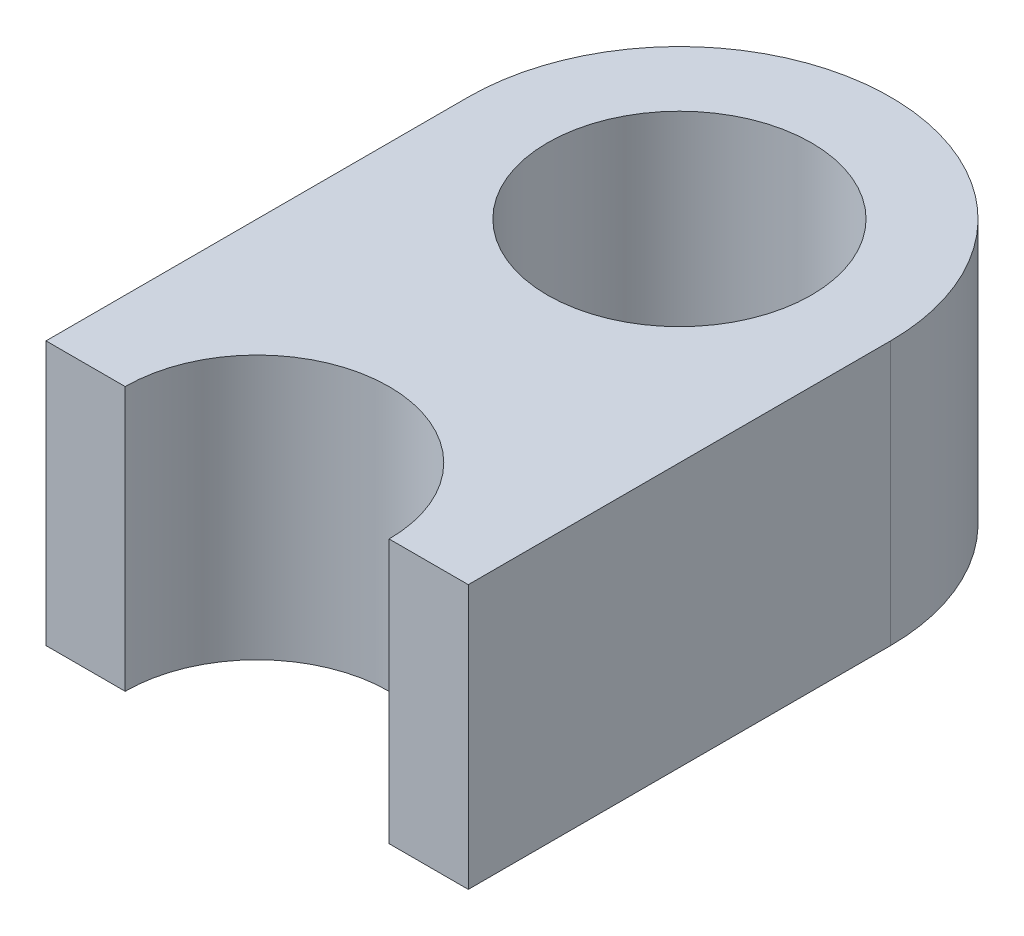
ISO-10303-21;
HEADER;
FILE_DESCRIPTION(('STEP AP214'),'2;1');
FILE_NAME('part.step','',(''),(''),'','','');
FILE_SCHEMA(('AUTOMOTIVE_DESIGN { 1 0 10303 214 1 1 1 1 }'));
ENDSEC;
DATA;
#1=APPLICATION_CONTEXT('core data for automotive mechanical design processes');
#2=APPLICATION_PROTOCOL_DEFINITION('international standard','automotive_design',2000,#1);
#3=PRODUCT_CONTEXT('',#1,'mechanical');
#4=PRODUCT('Part','Part','',(#3));
#5=PRODUCT_RELATED_PRODUCT_CATEGORY('part','',(#4));
#6=PRODUCT_DEFINITION_FORMATION('','',#4);
#7=PRODUCT_DEFINITION_CONTEXT('part definition',#1,'design');
#8=PRODUCT_DEFINITION('design','',#6,#7);
#9=PRODUCT_DEFINITION_SHAPE('','',#8);
#10=(LENGTH_UNIT() NAMED_UNIT(*) SI_UNIT(.MILLI.,.METRE.));
#11=(NAMED_UNIT(*) PLANE_ANGLE_UNIT() SI_UNIT($,.RADIAN.));
#12=(NAMED_UNIT(*) SI_UNIT($,.STERADIAN.) SOLID_ANGLE_UNIT());
#13=UNCERTAINTY_MEASURE_WITH_UNIT(LENGTH_MEASURE(1.E-05),#10,'distance_accuracy_value','');
#14=(GEOMETRIC_REPRESENTATION_CONTEXT(3) GLOBAL_UNCERTAINTY_ASSIGNED_CONTEXT((#13)) GLOBAL_UNIT_ASSIGNED_CONTEXT((#10,
#11,#12)) REPRESENTATION_CONTEXT('',''));
#15=CARTESIAN_POINT('',(0.,0.,0.));
#16=DIRECTION('',(0.,0.,1.));
#17=DIRECTION('',(1.,0.,0.));
#18=AXIS2_PLACEMENT_3D('',#15,#16,#17);
#19=CARTESIAN_POINT('',(13.04,0.5,-1.6));
#20=DIRECTION('',(0.,-1.,0.));
#21=DIRECTION('',(0.,0.,-1.));
#22=AXIS2_PLACEMENT_3D('',#19,#20,#21);
#23=CYLINDRICAL_SURFACE('',#22,0.8);
#24=CARTESIAN_POINT('',(13.04,-0.500000044703484,-1.6));
#25=DIRECTION('',(0.,-1.,0.));
#26=DIRECTION('',(0.,0.,-1.));
#27=AXIS2_PLACEMENT_3D('',#24,#25,#26);
#28=CIRCLE('',#27,0.8);
#29=CARTESIAN_POINT('',(13.84,-0.500000044703484,-1.6));
#30=VERTEX_POINT('',#29);
#31=CARTESIAN_POINT('',(12.24,-0.500000044703484,-1.6));
#32=VERTEX_POINT('',#31);
#33=EDGE_CURVE('E80',#30,#32,#28,.F.);
#34=ORIENTED_EDGE('',*,*,#33,.T.);
#35=DIRECTION('',(0.,1.,0.));
#36=VECTOR('',#35,1.);
#37=CARTESIAN_POINT('',(12.24,0.5,-1.6));
#38=LINE('',#37,#36);
#39=CARTESIAN_POINT('',(12.24,0.5,-1.6));
#40=VERTEX_POINT('',#39);
#41=EDGE_CURVE('E79',#40,#32,#38,.F.);
#42=ORIENTED_EDGE('',*,*,#41,.F.);
#43=CARTESIAN_POINT('',(13.04,0.5,-1.6));
#44=DIRECTION('',(0.,-1.,0.));
#45=DIRECTION('',(0.,0.,-1.));
#46=AXIS2_PLACEMENT_3D('',#43,#44,#45);
#47=CIRCLE('',#46,0.8);
#48=CARTESIAN_POINT('',(13.84,0.5,-1.6));
#49=VERTEX_POINT('',#48);
#50=EDGE_CURVE('E20',#49,#40,#47,.F.);
#51=ORIENTED_EDGE('',*,*,#50,.F.);
#52=DIRECTION('',(0.,1.,0.));
#53=VECTOR('',#52,1.);
#54=CARTESIAN_POINT('',(13.84,0.5,-1.6));
#55=LINE('',#54,#53);
#56=EDGE_CURVE('E65',#30,#49,#55,.T.);
#57=ORIENTED_EDGE('',*,*,#56,.F.);
#58=EDGE_LOOP('',(#34,#42,#51,#57));
#59=FACE_BOUND('',#58,.T.);
#60=ADVANCED_FACE('F17',(#59),#23,.T.);
#61=CARTESIAN_POINT('',(12.24,0.5,0.));
#62=DIRECTION('',(-1.,0.,0.));
#63=DIRECTION('',(0.,0.,1.));
#64=AXIS2_PLACEMENT_3D('',#61,#62,#63);
#65=PLANE('',#64);
#66=DIRECTION('',(0.,0.,1.));
#67=VECTOR('',#66,1.);
#68=CARTESIAN_POINT('',(12.24,-0.500000044703484,-0.5));
#69=LINE('',#68,#67);
#70=CARTESIAN_POINT('',(12.24,-0.500000044703484,0.));
#71=VERTEX_POINT('',#70);
#72=EDGE_CURVE('E120',#32,#71,#69,.T.);
#73=ORIENTED_EDGE('',*,*,#72,.T.);
#74=DIRECTION('',(0.,1.,0.));
#75=VECTOR('',#74,1.);
#76=CARTESIAN_POINT('',(12.24,0.5,0.));
#77=LINE('',#76,#75);
#78=CARTESIAN_POINT('',(12.24,0.5,0.));
#79=VERTEX_POINT('',#78);
#80=EDGE_CURVE('E84',#79,#71,#77,.F.);
#81=ORIENTED_EDGE('',*,*,#80,.F.);
#82=DIRECTION('',(0.,0.,1.));
#83=VECTOR('',#82,1.);
#84=CARTESIAN_POINT('',(12.24,0.5,-0.5));
#85=LINE('',#84,#83);
#86=EDGE_CURVE('E73',#40,#79,#85,.T.);
#87=ORIENTED_EDGE('',*,*,#86,.F.);
#88=ORIENTED_EDGE('',*,*,#41,.T.);
#89=EDGE_LOOP('',(#73,#81,#87,#88));
#90=FACE_BOUND('',#89,.T.);
#91=ADVANCED_FACE('F86',(#90),#65,.T.);
#92=CARTESIAN_POINT('',(12.54,0.5,0.));
#93=DIRECTION('',(0.,0.,1.));
#94=DIRECTION('',(1.,0.,0.));
#95=AXIS2_PLACEMENT_3D('',#92,#93,#94);
#96=PLANE('',#95);
#97=DIRECTION('',(1.,0.,0.));
#98=VECTOR('',#97,1.);
#99=CARTESIAN_POINT('',(20.5,-0.500000044703484,0.));
#100=LINE('',#99,#98);
#101=CARTESIAN_POINT('',(12.54,-0.500000044703484,0.));
#102=VERTEX_POINT('',#101);
#103=EDGE_CURVE('E119',#71,#102,#100,.T.);
#104=ORIENTED_EDGE('',*,*,#103,.T.);
#105=DIRECTION('',(0.,-1.,0.));
#106=VECTOR('',#105,1.);
#107=CARTESIAN_POINT('',(12.54,0.5,0.));
#108=LINE('',#107,#106);
#109=CARTESIAN_POINT('',(12.54,0.5,0.));
#110=VERTEX_POINT('',#109);
#111=EDGE_CURVE('E106',#102,#110,#108,.F.);
#112=ORIENTED_EDGE('',*,*,#111,.T.);
#113=DIRECTION('',(1.,0.,0.));
#114=VECTOR('',#113,1.);
#115=CARTESIAN_POINT('',(20.5,0.5,0.));
#116=LINE('',#115,#114);
#117=EDGE_CURVE('E88',#79,#110,#116,.T.);
#118=ORIENTED_EDGE('',*,*,#117,.F.);
#119=ORIENTED_EDGE('',*,*,#80,.T.);
#120=EDGE_LOOP('',(#104,#112,#118,#119));
#121=FACE_BOUND('',#120,.T.);
#122=ADVANCED_FACE('F153',(#121),#96,.T.);
#123=CARTESIAN_POINT('',(13.04,0.5,0.));
#124=DIRECTION('',(0.,-1.,0.));
#125=DIRECTION('',(0.,0.,-1.));
#126=AXIS2_PLACEMENT_3D('',#123,#124,#125);
#127=CYLINDRICAL_SURFACE('',#126,0.5);
#128=ORIENTED_EDGE('',*,*,#111,.F.);
#129=CARTESIAN_POINT('',(13.04,-0.500000044703484,0.));
#130=DIRECTION('',(0.,-1.,0.));
#131=DIRECTION('',(0.,0.,-1.));
#132=AXIS2_PLACEMENT_3D('',#129,#130,#131);
#133=CIRCLE('',#132,0.5);
#134=CARTESIAN_POINT('',(13.54,-0.500000044703484,0.));
#135=VERTEX_POINT('',#134);
#136=EDGE_CURVE('E115',#102,#135,#133,.T.);
#137=ORIENTED_EDGE('',*,*,#136,.T.);
#138=DIRECTION('',(0.,1.,0.));
#139=VECTOR('',#138,1.);
#140=CARTESIAN_POINT('',(13.54,0.5,0.));
#141=LINE('',#140,#139);
#142=CARTESIAN_POINT('',(13.54,0.5,0.));
#143=VERTEX_POINT('',#142);
#144=EDGE_CURVE('E102',#143,#135,#141,.F.);
#145=ORIENTED_EDGE('',*,*,#144,.F.);
#146=CARTESIAN_POINT('',(13.04,0.5,0.));
#147=DIRECTION('',(0.,-1.,0.));
#148=DIRECTION('',(0.,0.,-1.));
#149=AXIS2_PLACEMENT_3D('',#146,#147,#148);
#150=CIRCLE('',#149,0.5);
#151=EDGE_CURVE('E90',#110,#143,#150,.T.);
#152=ORIENTED_EDGE('',*,*,#151,.F.);
#153=EDGE_LOOP('',(#128,#137,#145,#152));
#154=FACE_BOUND('',#153,.T.);
#155=ADVANCED_FACE('F150',(#154),#127,.F.);
#156=CARTESIAN_POINT('',(13.84,0.5,0.));
#157=DIRECTION('',(0.,0.,1.));
#158=DIRECTION('',(1.,0.,0.));
#159=AXIS2_PLACEMENT_3D('',#156,#157,#158);
#160=PLANE('',#159);
#161=DIRECTION('',(1.,0.,0.));
#162=VECTOR('',#161,1.);
#163=CARTESIAN_POINT('',(20.5,-0.500000044703484,0.));
#164=LINE('',#163,#162);
#165=CARTESIAN_POINT('',(13.84,-0.500000044703484,0.));
#166=VERTEX_POINT('',#165);
#167=EDGE_CURVE('E118',#135,#166,#164,.T.);
#168=ORIENTED_EDGE('',*,*,#167,.T.);
#169=DIRECTION('',(0.,1.,0.));
#170=VECTOR('',#169,1.);
#171=CARTESIAN_POINT('',(13.84,0.5,0.));
#172=LINE('',#171,#170);
#173=CARTESIAN_POINT('',(13.84,0.5,0.));
#174=VERTEX_POINT('',#173);
#175=EDGE_CURVE('E35',#174,#166,#172,.F.);
#176=ORIENTED_EDGE('',*,*,#175,.F.);
#177=DIRECTION('',(1.,0.,0.));
#178=VECTOR('',#177,1.);
#179=CARTESIAN_POINT('',(20.5,0.5,0.));
#180=LINE('',#179,#178);
#181=EDGE_CURVE('E121',#143,#174,#180,.T.);
#182=ORIENTED_EDGE('',*,*,#181,.F.);
#183=ORIENTED_EDGE('',*,*,#144,.T.);
#184=EDGE_LOOP('',(#168,#176,#182,#183));
#185=FACE_BOUND('',#184,.T.);
#186=ADVANCED_FACE('F148',(#185),#160,.T.);
#187=CARTESIAN_POINT('',(13.84,0.5,-1.6));
#188=DIRECTION('',(1.,0.,0.));
#189=DIRECTION('',(0.,0.,-1.));
#190=AXIS2_PLACEMENT_3D('',#187,#188,#189);
#191=PLANE('',#190);
#192=DIRECTION('',(0.,0.,1.));
#193=VECTOR('',#192,1.);
#194=CARTESIAN_POINT('',(13.84,-0.500000044703484,-0.5));
#195=LINE('',#194,#193);
#196=EDGE_CURVE('E114',#166,#30,#195,.F.);
#197=ORIENTED_EDGE('',*,*,#196,.T.);
#198=ORIENTED_EDGE('',*,*,#56,.T.);
#199=DIRECTION('',(0.,0.,1.));
#200=VECTOR('',#199,1.);
#201=CARTESIAN_POINT('',(13.84,0.5,-0.5));
#202=LINE('',#201,#200);
#203=EDGE_CURVE('E76',#174,#49,#202,.F.);
#204=ORIENTED_EDGE('',*,*,#203,.F.);
#205=ORIENTED_EDGE('',*,*,#175,.T.);
#206=EDGE_LOOP('',(#197,#198,#204,#205));
#207=FACE_BOUND('',#206,.T.);
#208=ADVANCED_FACE('F142',(#207),#191,.T.);
#209=CARTESIAN_POINT('',(20.5,0.5,-0.5));
#210=DIRECTION('',(0.,1.,0.));
#211=DIRECTION('',(0.,0.,1.));
#212=AXIS2_PLACEMENT_3D('',#209,#210,#211);
#213=PLANE('',#212);
#214=CARTESIAN_POINT('',(13.04,0.5,-1.6));
#215=DIRECTION('',(0.,-1.,0.));
#216=DIRECTION('',(0.,0.,-1.));
#217=AXIS2_PLACEMENT_3D('',#214,#215,#216);
#218=CIRCLE('',#217,0.5);
#219=CARTESIAN_POINT('',(13.04,0.5,-2.1));
#220=VERTEX_POINT('',#219);
#221=EDGE_CURVE('E26',#220,#220,#218,.T.);
#222=ORIENTED_EDGE('',*,*,#221,.T.);
#223=EDGE_LOOP('',(#222));
#224=FACE_BOUND('',#223,.T.);
#225=ORIENTED_EDGE('',*,*,#151,.T.);
#226=ORIENTED_EDGE('',*,*,#181,.T.);
#227=ORIENTED_EDGE('',*,*,#203,.T.);
#228=ORIENTED_EDGE('',*,*,#50,.T.);
#229=ORIENTED_EDGE('',*,*,#86,.T.);
#230=ORIENTED_EDGE('',*,*,#117,.T.);
#231=EDGE_LOOP('',(#225,#226,#227,#228,#229,#230));
#232=FACE_BOUND('',#231,.T.);
#233=ADVANCED_FACE('F71',(#224,#232),#213,.T.);
#234=CARTESIAN_POINT('',(20.5,-0.500000044703484,-0.5));
#235=DIRECTION('',(0.,1.,0.));
#236=DIRECTION('',(0.,0.,1.));
#237=AXIS2_PLACEMENT_3D('',#234,#235,#236);
#238=PLANE('',#237);
#239=CARTESIAN_POINT('',(13.04,-0.500000044703484,-1.6));
#240=DIRECTION('',(0.,-1.,0.));
#241=DIRECTION('',(0.,0.,-1.));
#242=AXIS2_PLACEMENT_3D('',#239,#240,#241);
#243=CIRCLE('',#242,0.5);
#244=CARTESIAN_POINT('',(13.04,-0.500000044703484,-2.1));
#245=VERTEX_POINT('',#244);
#246=EDGE_CURVE('E11',#245,#245,#243,.F.);
#247=ORIENTED_EDGE('',*,*,#246,.T.);
#248=EDGE_LOOP('',(#247));
#249=FACE_BOUND('',#248,.T.);
#250=ORIENTED_EDGE('',*,*,#167,.F.);
#251=ORIENTED_EDGE('',*,*,#136,.F.);
#252=ORIENTED_EDGE('',*,*,#103,.F.);
#253=ORIENTED_EDGE('',*,*,#72,.F.);
#254=ORIENTED_EDGE('',*,*,#33,.F.);
#255=ORIENTED_EDGE('',*,*,#196,.F.);
#256=EDGE_LOOP('',(#250,#251,#252,#253,#254,#255));
#257=FACE_BOUND('',#256,.T.);
#258=ADVANCED_FACE('F145',(#249,#257),#238,.F.);
#259=CARTESIAN_POINT('',(13.04,0.5,-1.6));
#260=DIRECTION('',(0.,-1.,0.));
#261=DIRECTION('',(0.,0.,-1.));
#262=AXIS2_PLACEMENT_3D('',#259,#260,#261);
#263=CYLINDRICAL_SURFACE('',#262,0.5);
#264=ORIENTED_EDGE('',*,*,#221,.F.);
#265=EDGE_LOOP('',(#264));
#266=FACE_BOUND('',#265,.T.);
#267=ORIENTED_EDGE('',*,*,#246,.F.);
#268=EDGE_LOOP('',(#267));
#269=FACE_BOUND('',#268,.T.);
#270=ADVANCED_FACE('F162',(#266,#269),#263,.F.);
#271=CLOSED_SHELL('',(#60,#91,#122,#155,#186,#208,#233,#258,#270));
#272=MANIFOLD_SOLID_BREP('B1',#271);
#273=ADVANCED_BREP_SHAPE_REPRESENTATION('',(#18,#272),#14);
#274=SHAPE_DEFINITION_REPRESENTATION(#9,#273);
ENDSEC;
END-ISO-10303-21;
